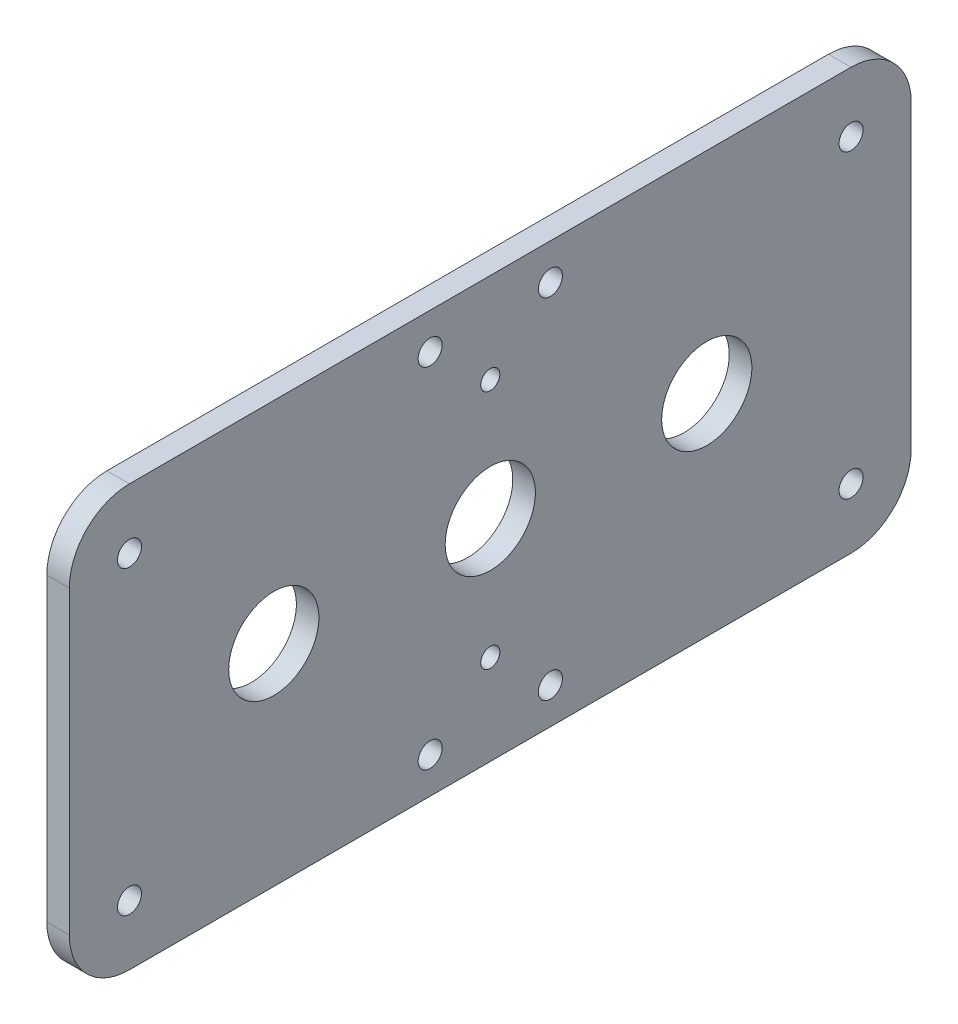
ISO-10303-21;
HEADER;
FILE_DESCRIPTION(('STEP AP214'),'2;1');
FILE_NAME('part.step','',(''),(''),'','','');
FILE_SCHEMA(('AUTOMOTIVE_DESIGN { 1 0 10303 214 1 1 1 1 }'));
ENDSEC;
DATA;
#1=APPLICATION_CONTEXT('core data for automotive mechanical design processes');
#2=APPLICATION_PROTOCOL_DEFINITION('international standard','automotive_design',2000,#1);
#3=PRODUCT_CONTEXT('',#1,'mechanical');
#4=PRODUCT('Part','Part','',(#3));
#5=PRODUCT_RELATED_PRODUCT_CATEGORY('part','',(#4));
#6=PRODUCT_DEFINITION_FORMATION('','',#4);
#7=PRODUCT_DEFINITION_CONTEXT('part definition',#1,'design');
#8=PRODUCT_DEFINITION('design','',#6,#7);
#9=PRODUCT_DEFINITION_SHAPE('','',#8);
#10=(LENGTH_UNIT() NAMED_UNIT(*) SI_UNIT(.MILLI.,.METRE.));
#11=(NAMED_UNIT(*) PLANE_ANGLE_UNIT() SI_UNIT($,.RADIAN.));
#12=(NAMED_UNIT(*) SI_UNIT($,.STERADIAN.) SOLID_ANGLE_UNIT());
#13=UNCERTAINTY_MEASURE_WITH_UNIT(LENGTH_MEASURE(1.E-05),#10,'distance_accuracy_value','');
#14=(GEOMETRIC_REPRESENTATION_CONTEXT(3) GLOBAL_UNCERTAINTY_ASSIGNED_CONTEXT((#13)) GLOBAL_UNIT_ASSIGNED_CONTEXT((#10,
#11,#12)) REPRESENTATION_CONTEXT('',''));
#15=CARTESIAN_POINT('',(0.,0.,0.));
#16=DIRECTION('',(0.,0.,1.));
#17=DIRECTION('',(1.,0.,0.));
#18=AXIS2_PLACEMENT_3D('',#15,#16,#17);
#19=CARTESIAN_POINT('',(4.7625,43.2742885665238,239.434866781271));
#20=DIRECTION('',(1.,0.,0.));
#21=DIRECTION('',(0.,0.,1.));
#22=AXIS2_PLACEMENT_3D('',#19,#20,#21);
#23=CYLINDRICAL_SURFACE('',#22,12.7);
#24=DIRECTION('',(1.,0.,0.));
#25=VECTOR('',#24,1.);
#26=CARTESIAN_POINT('',(4.7625,43.2742885665239,226.734866781271));
#27=LINE('',#26,#25);
#28=CARTESIAN_POINT('',(0.,43.2742885665239,226.734866781271));
#29=VERTEX_POINT('',#28);
#30=CARTESIAN_POINT('',(4.7625,43.2742885665239,226.734866781271));
#31=VERTEX_POINT('',#30);
#32=EDGE_CURVE('E11',#29,#31,#27,.T.);
#33=ORIENTED_EDGE('',*,*,#32,.T.);
#34=CARTESIAN_POINT('',(4.7625,43.2742885665238,239.434866781271));
#35=DIRECTION('',(-1.,0.,0.));
#36=DIRECTION('',(0.,0.,1.));
#37=AXIS2_PLACEMENT_3D('',#34,#35,#36);
#38=CIRCLE('',#37,12.7);
#39=CARTESIAN_POINT('',(4.7625,30.5742885665238,239.434866781271));
#40=VERTEX_POINT('',#39);
#41=EDGE_CURVE('E198',#31,#40,#38,.T.);
#42=ORIENTED_EDGE('',*,*,#41,.T.);
#43=DIRECTION('',(1.,0.,0.));
#44=VECTOR('',#43,1.);
#45=CARTESIAN_POINT('',(4.7625,30.5742885665238,239.434866781271));
#46=LINE('',#45,#44);
#47=CARTESIAN_POINT('',(0.,30.5742885665238,239.434866781271));
#48=VERTEX_POINT('',#47);
#49=EDGE_CURVE('E47',#48,#40,#46,.T.);
#50=ORIENTED_EDGE('',*,*,#49,.F.);
#51=CARTESIAN_POINT('',(0.,43.2742885665238,239.434866781271));
#52=DIRECTION('',(-1.,0.,0.));
#53=DIRECTION('',(0.,0.,1.));
#54=AXIS2_PLACEMENT_3D('',#51,#52,#53);
#55=CIRCLE('',#54,12.7);
#56=EDGE_CURVE('E93',#29,#48,#55,.T.);
#57=ORIENTED_EDGE('',*,*,#56,.F.);
#58=EDGE_LOOP('',(#33,#42,#50,#57));
#59=FACE_BOUND('',#58,.T.);
#60=ADVANCED_FACE('F37',(#59),#23,.T.);
#61=CARTESIAN_POINT('',(4.7625,30.5742885665238,391.834866781271));
#62=DIRECTION('',(0.,-1.,0.));
#63=DIRECTION('',(0.,0.,1.));
#64=AXIS2_PLACEMENT_3D('',#61,#62,#63);
#65=PLANE('',#64);
#66=ORIENTED_EDGE('',*,*,#49,.T.);
#67=DIRECTION('',(0.,0.,1.));
#68=VECTOR('',#67,1.);
#69=CARTESIAN_POINT('',(4.7625,30.5742885665238,391.834866781271));
#70=LINE('',#69,#68);
#71=CARTESIAN_POINT('',(4.7625,30.5742885665238,391.834866781271));
#72=VERTEX_POINT('',#71);
#73=EDGE_CURVE('E193',#40,#72,#70,.T.);
#74=ORIENTED_EDGE('',*,*,#73,.T.);
#75=DIRECTION('',(1.,0.,0.));
#76=VECTOR('',#75,1.);
#77=CARTESIAN_POINT('',(4.7625,30.5742885665238,391.834866781271));
#78=LINE('',#77,#76);
#79=CARTESIAN_POINT('',(0.,30.5742885665238,391.834866781271));
#80=VERTEX_POINT('',#79);
#81=EDGE_CURVE('E180',#80,#72,#78,.T.);
#82=ORIENTED_EDGE('',*,*,#81,.F.);
#83=DIRECTION('',(0.,0.,1.));
#84=VECTOR('',#83,1.);
#85=CARTESIAN_POINT('',(0.,30.5742885665238,239.434866781271));
#86=LINE('',#85,#84);
#87=EDGE_CURVE('E147',#48,#80,#86,.T.);
#88=ORIENTED_EDGE('',*,*,#87,.F.);
#89=EDGE_LOOP('',(#66,#74,#82,#88));
#90=FACE_BOUND('',#89,.T.);
#91=ADVANCED_FACE('F189',(#90),#65,.T.);
#92=CARTESIAN_POINT('',(4.7625,43.2742885665238,391.834866781271));
#93=DIRECTION('',(1.,0.,0.));
#94=DIRECTION('',(0.,0.,1.));
#95=AXIS2_PLACEMENT_3D('',#92,#93,#94);
#96=CYLINDRICAL_SURFACE('',#95,12.7);
#97=ORIENTED_EDGE('',*,*,#81,.T.);
#98=CARTESIAN_POINT('',(4.7625,43.2742885665238,391.834866781271));
#99=DIRECTION('',(-1.,0.,0.));
#100=DIRECTION('',(0.,0.,1.));
#101=AXIS2_PLACEMENT_3D('',#98,#99,#100);
#102=CIRCLE('',#101,12.7);
#103=CARTESIAN_POINT('',(4.7625,43.2742885665239,404.534866781271));
#104=VERTEX_POINT('',#103);
#105=EDGE_CURVE('E201',#72,#104,#102,.T.);
#106=ORIENTED_EDGE('',*,*,#105,.T.);
#107=DIRECTION('',(1.,0.,0.));
#108=VECTOR('',#107,1.);
#109=CARTESIAN_POINT('',(4.7625,43.2742885665239,404.534866781271));
#110=LINE('',#109,#108);
#111=CARTESIAN_POINT('',(0.,43.2742885665239,404.534866781271));
#112=VERTEX_POINT('',#111);
#113=EDGE_CURVE('E177',#112,#104,#110,.T.);
#114=ORIENTED_EDGE('',*,*,#113,.F.);
#115=CARTESIAN_POINT('',(0.,43.2742885665238,391.834866781271));
#116=DIRECTION('',(-1.,0.,0.));
#117=DIRECTION('',(0.,0.,1.));
#118=AXIS2_PLACEMENT_3D('',#115,#116,#117);
#119=CIRCLE('',#118,12.7);
#120=EDGE_CURVE('E144',#80,#112,#119,.T.);
#121=ORIENTED_EDGE('',*,*,#120,.F.);
#122=EDGE_LOOP('',(#97,#106,#114,#121));
#123=FACE_BOUND('',#122,.T.);
#124=ADVANCED_FACE('F264',(#123),#96,.T.);
#125=CARTESIAN_POINT('',(4.7625,43.2742885665239,404.534866781271));
#126=DIRECTION('',(0.,0.,1.));
#127=DIRECTION('',(0.,1.,0.));
#128=AXIS2_PLACEMENT_3D('',#125,#126,#127);
#129=PLANE('',#128);
#130=ORIENTED_EDGE('',*,*,#113,.T.);
#131=DIRECTION('',(0.,1.,0.));
#132=VECTOR('',#131,1.);
#133=CARTESIAN_POINT('',(4.7625,43.2742885665239,404.534866781271));
#134=LINE('',#133,#132);
#135=CARTESIAN_POINT('',(4.7625,106.774288566524,404.534866781271));
#136=VERTEX_POINT('',#135);
#137=EDGE_CURVE('E208',#104,#136,#134,.T.);
#138=ORIENTED_EDGE('',*,*,#137,.T.);
#139=DIRECTION('',(1.,0.,0.));
#140=VECTOR('',#139,1.);
#141=CARTESIAN_POINT('',(4.7625,106.774288566524,404.534866781271));
#142=LINE('',#141,#140);
#143=CARTESIAN_POINT('',(0.,106.774288566524,404.534866781271));
#144=VERTEX_POINT('',#143);
#145=EDGE_CURVE('E174',#144,#136,#142,.T.);
#146=ORIENTED_EDGE('',*,*,#145,.F.);
#147=DIRECTION('',(0.,1.,0.));
#148=VECTOR('',#147,1.);
#149=CARTESIAN_POINT('',(0.,106.774288566524,404.534866781271));
#150=LINE('',#149,#148);
#151=EDGE_CURVE('E141',#112,#144,#150,.T.);
#152=ORIENTED_EDGE('',*,*,#151,.F.);
#153=EDGE_LOOP('',(#130,#138,#146,#152));
#154=FACE_BOUND('',#153,.T.);
#155=ADVANCED_FACE('F375',(#154),#129,.T.);
#156=CARTESIAN_POINT('',(4.7625,106.774288566524,391.834866781271));
#157=DIRECTION('',(1.,0.,0.));
#158=DIRECTION('',(0.,0.,1.));
#159=AXIS2_PLACEMENT_3D('',#156,#157,#158);
#160=CYLINDRICAL_SURFACE('',#159,12.7);
#161=ORIENTED_EDGE('',*,*,#145,.T.);
#162=CARTESIAN_POINT('',(4.7625,106.774288566524,391.834866781271));
#163=DIRECTION('',(-1.,0.,0.));
#164=DIRECTION('',(0.,0.,1.));
#165=AXIS2_PLACEMENT_3D('',#162,#163,#164);
#166=CIRCLE('',#165,12.7);
#167=CARTESIAN_POINT('',(4.7625,119.474288566524,391.834866781271));
#168=VERTEX_POINT('',#167);
#169=EDGE_CURVE('E211',#136,#168,#166,.T.);
#170=ORIENTED_EDGE('',*,*,#169,.T.);
#171=DIRECTION('',(1.,0.,0.));
#172=VECTOR('',#171,1.);
#173=CARTESIAN_POINT('',(4.7625,119.474288566524,391.834866781271));
#174=LINE('',#173,#172);
#175=CARTESIAN_POINT('',(0.,119.474288566524,391.834866781271));
#176=VERTEX_POINT('',#175);
#177=EDGE_CURVE('E108',#176,#168,#174,.T.);
#178=ORIENTED_EDGE('',*,*,#177,.F.);
#179=CARTESIAN_POINT('',(0.,106.774288566524,391.834866781271));
#180=DIRECTION('',(-1.,0.,0.));
#181=DIRECTION('',(0.,0.,1.));
#182=AXIS2_PLACEMENT_3D('',#179,#180,#181);
#183=CIRCLE('',#182,12.7);
#184=EDGE_CURVE('E139',#144,#176,#183,.T.);
#185=ORIENTED_EDGE('',*,*,#184,.F.);
#186=EDGE_LOOP('',(#161,#170,#178,#185));
#187=FACE_BOUND('',#186,.T.);
#188=ADVANCED_FACE('F387',(#187),#160,.T.);
#189=CARTESIAN_POINT('',(4.7625,119.474288566524,391.834866781271));
#190=DIRECTION('',(0.,1.,0.));
#191=DIRECTION('',(0.,0.,-1.));
#192=AXIS2_PLACEMENT_3D('',#189,#190,#191);
#193=PLANE('',#192);
#194=ORIENTED_EDGE('',*,*,#177,.T.);
#195=DIRECTION('',(0.,0.,-1.));
#196=VECTOR('',#195,1.);
#197=CARTESIAN_POINT('',(4.7625,119.474288566524,391.834866781271));
#198=LINE('',#197,#196);
#199=CARTESIAN_POINT('',(4.7625,119.474288566524,239.434866781271));
#200=VERTEX_POINT('',#199);
#201=EDGE_CURVE('E214',#168,#200,#198,.T.);
#202=ORIENTED_EDGE('',*,*,#201,.T.);
#203=DIRECTION('',(1.,0.,0.));
#204=VECTOR('',#203,1.);
#205=CARTESIAN_POINT('',(4.7625,119.474288566524,239.434866781271));
#206=LINE('',#205,#204);
#207=CARTESIAN_POINT('',(0.,119.474288566524,239.434866781271));
#208=VERTEX_POINT('',#207);
#209=EDGE_CURVE('E106',#208,#200,#206,.T.);
#210=ORIENTED_EDGE('',*,*,#209,.F.);
#211=DIRECTION('',(0.,0.,1.));
#212=VECTOR('',#211,1.);
#213=CARTESIAN_POINT('',(0.,119.474288566524,239.434866781271));
#214=LINE('',#213,#212);
#215=EDGE_CURVE('E100',#176,#208,#214,.F.);
#216=ORIENTED_EDGE('',*,*,#215,.F.);
#217=EDGE_LOOP('',(#194,#202,#210,#216));
#218=FACE_BOUND('',#217,.T.);
#219=ADVANCED_FACE('F400',(#218),#193,.T.);
#220=CARTESIAN_POINT('',(4.7625,106.774288566524,239.434866781271));
#221=DIRECTION('',(1.,0.,0.));
#222=DIRECTION('',(0.,0.,1.));
#223=AXIS2_PLACEMENT_3D('',#220,#221,#222);
#224=CYLINDRICAL_SURFACE('',#223,12.7);
#225=ORIENTED_EDGE('',*,*,#209,.T.);
#226=CARTESIAN_POINT('',(4.7625,106.774288566524,239.434866781271));
#227=DIRECTION('',(-1.,0.,0.));
#228=DIRECTION('',(0.,0.,1.));
#229=AXIS2_PLACEMENT_3D('',#226,#227,#228);
#230=CIRCLE('',#229,12.7);
#231=CARTESIAN_POINT('',(4.7625,106.774288566524,226.734866781271));
#232=VERTEX_POINT('',#231);
#233=EDGE_CURVE('E55',#200,#232,#230,.T.);
#234=ORIENTED_EDGE('',*,*,#233,.T.);
#235=DIRECTION('',(1.,0.,0.));
#236=VECTOR('',#235,1.);
#237=CARTESIAN_POINT('',(4.7625,106.774288566524,226.734866781271));
#238=LINE('',#237,#236);
#239=CARTESIAN_POINT('',(0.,106.774288566524,226.734866781271));
#240=VERTEX_POINT('',#239);
#241=EDGE_CURVE('E41',#240,#232,#238,.T.);
#242=ORIENTED_EDGE('',*,*,#241,.F.);
#243=CARTESIAN_POINT('',(0.,106.774288566524,239.434866781271));
#244=DIRECTION('',(-1.,0.,0.));
#245=DIRECTION('',(0.,0.,1.));
#246=AXIS2_PLACEMENT_3D('',#243,#244,#245);
#247=CIRCLE('',#246,12.7);
#248=EDGE_CURVE('E94',#208,#240,#247,.T.);
#249=ORIENTED_EDGE('',*,*,#248,.F.);
#250=EDGE_LOOP('',(#225,#234,#242,#249));
#251=FACE_BOUND('',#250,.T.);
#252=ADVANCED_FACE('F105',(#251),#224,.T.);
#253=CARTESIAN_POINT('',(4.7625,75.0242885665238,269.914866781271));
#254=DIRECTION('',(1.,0.,0.));
#255=DIRECTION('',(0.,0.,1.));
#256=AXIS2_PLACEMENT_3D('',#253,#254,#255);
#257=CYLINDRICAL_SURFACE('',#256,9.52500000000002);
#258=CARTESIAN_POINT('',(4.7625,75.0242885665238,269.914866781271));
#259=DIRECTION('',(-1.,0.,0.));
#260=DIRECTION('',(0.,0.,1.));
#261=AXIS2_PLACEMENT_3D('',#258,#259,#260);
#262=CIRCLE('',#261,9.52500000000002);
#263=CARTESIAN_POINT('',(4.7625,75.0242885665238,279.439866781271));
#264=VERTEX_POINT('',#263);
#265=EDGE_CURVE('E170',#264,#264,#262,.T.);
#266=ORIENTED_EDGE('',*,*,#265,.F.);
#267=EDGE_LOOP('',(#266));
#268=FACE_BOUND('',#267,.T.);
#269=CARTESIAN_POINT('',(0.,75.0242885665238,269.914866781271));
#270=DIRECTION('',(-1.,0.,0.));
#271=DIRECTION('',(0.,0.,1.));
#272=AXIS2_PLACEMENT_3D('',#269,#270,#271);
#273=CIRCLE('',#272,9.52500000000002);
#274=CARTESIAN_POINT('',(0.,75.0242885665238,279.439866781271));
#275=VERTEX_POINT('',#274);
#276=EDGE_CURVE('E120',#275,#275,#273,.T.);
#277=ORIENTED_EDGE('',*,*,#276,.T.);
#278=EDGE_LOOP('',(#277));
#279=FACE_BOUND('',#278,.T.);
#280=ADVANCED_FACE('F331',(#268,#279),#257,.F.);
#281=CARTESIAN_POINT('',(4.7625,106.774288566524,239.434866781271));
#282=DIRECTION('',(1.,0.,0.));
#283=DIRECTION('',(0.,0.,1.));
#284=AXIS2_PLACEMENT_3D('',#281,#282,#283);
#285=CYLINDRICAL_SURFACE('',#284,2.53999999999998);
#286=CARTESIAN_POINT('',(4.7625,106.774288566524,239.434866781271));
#287=DIRECTION('',(-1.,0.,0.));
#288=DIRECTION('',(0.,0.,1.));
#289=AXIS2_PLACEMENT_3D('',#286,#287,#288);
#290=CIRCLE('',#289,2.53999999999998);
#291=CARTESIAN_POINT('',(4.7625,106.774288566524,241.974866781271));
#292=VERTEX_POINT('',#291);
#293=EDGE_CURVE('E590',#292,#292,#290,.T.);
#294=ORIENTED_EDGE('',*,*,#293,.F.);
#295=EDGE_LOOP('',(#294));
#296=FACE_BOUND('',#295,.T.);
#297=CARTESIAN_POINT('',(0.,106.774288566524,239.434866781271));
#298=DIRECTION('',(-1.,0.,0.));
#299=DIRECTION('',(0.,0.,1.));
#300=AXIS2_PLACEMENT_3D('',#297,#298,#299);
#301=CIRCLE('',#300,2.53999999999998);
#302=CARTESIAN_POINT('',(0.,106.774288566524,241.974866781271));
#303=VERTEX_POINT('',#302);
#304=EDGE_CURVE('E123',#303,#303,#301,.T.);
#305=ORIENTED_EDGE('',*,*,#304,.T.);
#306=EDGE_LOOP('',(#305));
#307=FACE_BOUND('',#306,.T.);
#308=ADVANCED_FACE('F336',(#296,#307),#285,.F.);
#309=CARTESIAN_POINT('',(4.7625,75.0242885665238,315.634866781271));
#310=DIRECTION('',(1.,0.,0.));
#311=DIRECTION('',(0.,0.,1.));
#312=AXIS2_PLACEMENT_3D('',#309,#310,#311);
#313=CYLINDRICAL_SURFACE('',#312,9.52500000000002);
#314=CARTESIAN_POINT('',(4.7625,75.0242885665238,315.634866781271));
#315=DIRECTION('',(-1.,0.,0.));
#316=DIRECTION('',(0.,0.,1.));
#317=AXIS2_PLACEMENT_3D('',#314,#315,#316);
#318=CIRCLE('',#317,9.52500000000002);
#319=CARTESIAN_POINT('',(4.7625,75.0242885665238,325.159866781271));
#320=VERTEX_POINT('',#319);
#321=EDGE_CURVE('E587',#320,#320,#318,.T.);
#322=ORIENTED_EDGE('',*,*,#321,.F.);
#323=EDGE_LOOP('',(#322));
#324=FACE_BOUND('',#323,.T.);
#325=CARTESIAN_POINT('',(0.,75.0242885665238,315.634866781271));
#326=DIRECTION('',(-1.,0.,0.));
#327=DIRECTION('',(0.,0.,1.));
#328=AXIS2_PLACEMENT_3D('',#325,#326,#327);
#329=CIRCLE('',#328,9.52500000000002);
#330=CARTESIAN_POINT('',(0.,75.0242885665238,325.159866781271));
#331=VERTEX_POINT('',#330);
#332=EDGE_CURVE('E126',#331,#331,#329,.T.);
#333=ORIENTED_EDGE('',*,*,#332,.T.);
#334=EDGE_LOOP('',(#333));
#335=FACE_BOUND('',#334,.T.);
#336=ADVANCED_FACE('F349',(#324,#335),#313,.F.);
#337=CARTESIAN_POINT('',(4.7625,43.2742885665238,239.434866781271));
#338=DIRECTION('',(1.,0.,0.));
#339=DIRECTION('',(0.,0.,1.));
#340=AXIS2_PLACEMENT_3D('',#337,#338,#339);
#341=CYLINDRICAL_SURFACE('',#340,2.53999999999998);
#342=CARTESIAN_POINT('',(4.7625,43.2742885665238,239.434866781271));
#343=DIRECTION('',(-1.,0.,0.));
#344=DIRECTION('',(0.,0.,1.));
#345=AXIS2_PLACEMENT_3D('',#342,#343,#344);
#346=CIRCLE('',#345,2.53999999999998);
#347=CARTESIAN_POINT('',(4.7625,43.2742885665238,241.974866781271));
#348=VERTEX_POINT('',#347);
#349=EDGE_CURVE('E582',#348,#348,#346,.T.);
#350=ORIENTED_EDGE('',*,*,#349,.F.);
#351=EDGE_LOOP('',(#350));
#352=FACE_BOUND('',#351,.T.);
#353=CARTESIAN_POINT('',(0.,43.2742885665238,239.434866781271));
#354=DIRECTION('',(-1.,0.,0.));
#355=DIRECTION('',(0.,0.,1.));
#356=AXIS2_PLACEMENT_3D('',#353,#354,#355);
#357=CIRCLE('',#356,2.53999999999998);
#358=CARTESIAN_POINT('',(0.,43.2742885665238,241.974866781271));
#359=VERTEX_POINT('',#358);
#360=EDGE_CURVE('E129',#359,#359,#357,.T.);
#361=ORIENTED_EDGE('',*,*,#360,.T.);
#362=EDGE_LOOP('',(#361));
#363=FACE_BOUND('',#362,.T.);
#364=ADVANCED_FACE('F362',(#352,#363),#341,.F.);
#365=CARTESIAN_POINT('',(4.7625,38.1942885665238,302.934866781271));
#366=DIRECTION('',(1.,0.,0.));
#367=DIRECTION('',(0.,0.,1.));
#368=AXIS2_PLACEMENT_3D('',#365,#366,#367);
#369=CYLINDRICAL_SURFACE('',#368,2.54000000000001);
#370=CARTESIAN_POINT('',(4.7625,38.1942885665238,302.934866781271));
#371=DIRECTION('',(-1.,0.,0.));
#372=DIRECTION('',(0.,0.,1.));
#373=AXIS2_PLACEMENT_3D('',#370,#371,#372);
#374=CIRCLE('',#373,2.54000000000001);
#375=CARTESIAN_POINT('',(4.7625,38.1942885665238,305.474866781271));
#376=VERTEX_POINT('',#375);
#377=EDGE_CURVE('E579',#376,#376,#374,.T.);
#378=ORIENTED_EDGE('',*,*,#377,.F.);
#379=EDGE_LOOP('',(#378));
#380=FACE_BOUND('',#379,.T.);
#381=CARTESIAN_POINT('',(0.,38.1942885665238,302.934866781271));
#382=DIRECTION('',(-1.,0.,0.));
#383=DIRECTION('',(0.,0.,1.));
#384=AXIS2_PLACEMENT_3D('',#381,#382,#383);
#385=CIRCLE('',#384,2.54000000000001);
#386=CARTESIAN_POINT('',(0.,38.1942885665238,305.474866781271));
#387=VERTEX_POINT('',#386);
#388=EDGE_CURVE('E132',#387,#387,#385,.T.);
#389=ORIENTED_EDGE('',*,*,#388,.T.);
#390=EDGE_LOOP('',(#389));
#391=FACE_BOUND('',#390,.T.);
#392=ADVANCED_FACE('F444',(#380,#391),#369,.F.);
#393=CARTESIAN_POINT('',(4.7625,111.854288566524,328.334866781271));
#394=DIRECTION('',(1.,0.,0.));
#395=DIRECTION('',(0.,0.,1.));
#396=AXIS2_PLACEMENT_3D('',#393,#394,#395);
#397=CYLINDRICAL_SURFACE('',#396,2.54000000000001);
#398=CARTESIAN_POINT('',(4.7625,111.854288566524,328.334866781271));
#399=DIRECTION('',(-1.,0.,0.));
#400=DIRECTION('',(0.,0.,1.));
#401=AXIS2_PLACEMENT_3D('',#398,#399,#400);
#402=CIRCLE('',#401,2.54000000000001);
#403=CARTESIAN_POINT('',(4.7625,111.854288566524,330.874866781271));
#404=VERTEX_POINT('',#403);
#405=EDGE_CURVE('E575',#404,#404,#402,.T.);
#406=ORIENTED_EDGE('',*,*,#405,.F.);
#407=EDGE_LOOP('',(#406));
#408=FACE_BOUND('',#407,.T.);
#409=CARTESIAN_POINT('',(0.,111.854288566524,328.334866781271));
#410=DIRECTION('',(-1.,0.,0.));
#411=DIRECTION('',(0.,0.,1.));
#412=AXIS2_PLACEMENT_3D('',#409,#410,#411);
#413=CIRCLE('',#412,2.54000000000001);
#414=CARTESIAN_POINT('',(0.,111.854288566524,330.874866781271));
#415=VERTEX_POINT('',#414);
#416=EDGE_CURVE('E103',#415,#415,#413,.T.);
#417=ORIENTED_EDGE('',*,*,#416,.T.);
#418=EDGE_LOOP('',(#417));
#419=FACE_BOUND('',#418,.T.);
#420=ADVANCED_FACE('F271',(#408,#419),#397,.F.);
#421=CARTESIAN_POINT('',(4.7625,43.2742885665239,226.734866781271));
#422=DIRECTION('',(0.,0.,-1.));
#423=DIRECTION('',(0.,-1.,0.));
#424=AXIS2_PLACEMENT_3D('',#421,#422,#423);
#425=PLANE('',#424);
#426=DIRECTION('',(0.,1.,0.));
#427=VECTOR('',#426,1.);
#428=CARTESIAN_POINT('',(0.,106.774288566524,226.734866781271));
#429=LINE('',#428,#427);
#430=EDGE_CURVE('E85',#240,#29,#429,.F.);
#431=ORIENTED_EDGE('',*,*,#430,.F.);
#432=ORIENTED_EDGE('',*,*,#241,.T.);
#433=DIRECTION('',(0.,-1.,0.));
#434=VECTOR('',#433,1.);
#435=CARTESIAN_POINT('',(4.7625,43.2742885665239,226.734866781271));
#436=LINE('',#435,#434);
#437=EDGE_CURVE('E199',#232,#31,#436,.T.);
#438=ORIENTED_EDGE('',*,*,#437,.T.);
#439=ORIENTED_EDGE('',*,*,#32,.F.);
#440=EDGE_LOOP('',(#431,#432,#438,#439));
#441=FACE_BOUND('',#440,.T.);
#442=ADVANCED_FACE('F90',(#441),#425,.T.);
#443=CARTESIAN_POINT('',(4.7625,111.854288566524,302.934866781271));
#444=DIRECTION('',(1.,0.,0.));
#445=DIRECTION('',(0.,0.,1.));
#446=AXIS2_PLACEMENT_3D('',#443,#444,#445);
#447=CYLINDRICAL_SURFACE('',#446,2.54000000000001);
#448=CARTESIAN_POINT('',(4.7625,111.854288566524,302.934866781271));
#449=DIRECTION('',(-1.,0.,0.));
#450=DIRECTION('',(0.,0.,1.));
#451=AXIS2_PLACEMENT_3D('',#448,#449,#450);
#452=CIRCLE('',#451,2.54000000000001);
#453=CARTESIAN_POINT('',(4.7625,111.854288566524,305.474866781271));
#454=VERTEX_POINT('',#453);
#455=EDGE_CURVE('E217',#454,#454,#452,.T.);
#456=ORIENTED_EDGE('',*,*,#455,.F.);
#457=EDGE_LOOP('',(#456));
#458=FACE_BOUND('',#457,.T.);
#459=CARTESIAN_POINT('',(0.,111.854288566524,302.934866781271));
#460=DIRECTION('',(-1.,0.,0.));
#461=DIRECTION('',(0.,0.,1.));
#462=AXIS2_PLACEMENT_3D('',#459,#460,#461);
#463=CIRCLE('',#462,2.54000000000001);
#464=CARTESIAN_POINT('',(0.,111.854288566524,305.474866781271));
#465=VERTEX_POINT('',#464);
#466=EDGE_CURVE('E138',#465,#465,#463,.T.);
#467=ORIENTED_EDGE('',*,*,#466,.T.);
#468=EDGE_LOOP('',(#467));
#469=FACE_BOUND('',#468,.T.);
#470=ADVANCED_FACE('F270',(#458,#469),#447,.F.);
#471=CARTESIAN_POINT('',(4.7625,100.424288566524,315.634866781271));
#472=DIRECTION('',(1.,0.,0.));
#473=DIRECTION('',(0.,0.,1.));
#474=AXIS2_PLACEMENT_3D('',#471,#472,#473);
#475=CYLINDRICAL_SURFACE('',#474,2.01929999999998);
#476=CARTESIAN_POINT('',(4.7625,100.424288566524,315.634866781271));
#477=DIRECTION('',(-1.,0.,0.));
#478=DIRECTION('',(0.,0.,1.));
#479=AXIS2_PLACEMENT_3D('',#476,#477,#478);
#480=CIRCLE('',#479,2.01929999999998);
#481=CARTESIAN_POINT('',(4.7625,100.424288566524,317.654166781271));
#482=VERTEX_POINT('',#481);
#483=EDGE_CURVE('E220',#482,#482,#480,.T.);
#484=ORIENTED_EDGE('',*,*,#483,.F.);
#485=EDGE_LOOP('',(#484));
#486=FACE_BOUND('',#485,.T.);
#487=CARTESIAN_POINT('',(0.,100.424288566524,315.634866781271));
#488=DIRECTION('',(-1.,0.,0.));
#489=DIRECTION('',(0.,0.,1.));
#490=AXIS2_PLACEMENT_3D('',#487,#488,#489);
#491=CIRCLE('',#490,2.01929999999998);
#492=CARTESIAN_POINT('',(0.,100.424288566524,317.654166781271));
#493=VERTEX_POINT('',#492);
#494=EDGE_CURVE('E153',#493,#493,#491,.T.);
#495=ORIENTED_EDGE('',*,*,#494,.T.);
#496=EDGE_LOOP('',(#495));
#497=FACE_BOUND('',#496,.T.);
#498=ADVANCED_FACE('F274',(#486,#497),#475,.F.);
#499=CARTESIAN_POINT('',(4.7625,38.1942885665238,328.334866781271));
#500=DIRECTION('',(1.,0.,0.));
#501=DIRECTION('',(0.,0.,1.));
#502=AXIS2_PLACEMENT_3D('',#499,#500,#501);
#503=CYLINDRICAL_SURFACE('',#502,2.54000000000001);
#504=CARTESIAN_POINT('',(4.7625,38.1942885665238,328.334866781271));
#505=DIRECTION('',(-1.,0.,0.));
#506=DIRECTION('',(0.,0.,1.));
#507=AXIS2_PLACEMENT_3D('',#504,#505,#506);
#508=CIRCLE('',#507,2.54000000000001);
#509=CARTESIAN_POINT('',(4.7625,38.1942885665238,330.874866781271));
#510=VERTEX_POINT('',#509);
#511=EDGE_CURVE('E223',#510,#510,#508,.T.);
#512=ORIENTED_EDGE('',*,*,#511,.F.);
#513=EDGE_LOOP('',(#512));
#514=FACE_BOUND('',#513,.T.);
#515=CARTESIAN_POINT('',(0.,38.1942885665238,328.334866781271));
#516=DIRECTION('',(-1.,0.,0.));
#517=DIRECTION('',(0.,0.,1.));
#518=AXIS2_PLACEMENT_3D('',#515,#516,#517);
#519=CIRCLE('',#518,2.54000000000001);
#520=CARTESIAN_POINT('',(0.,38.1942885665238,330.874866781271));
#521=VERTEX_POINT('',#520);
#522=EDGE_CURVE('E156',#521,#521,#519,.T.);
#523=ORIENTED_EDGE('',*,*,#522,.T.);
#524=EDGE_LOOP('',(#523));
#525=FACE_BOUND('',#524,.T.);
#526=ADVANCED_FACE('F278',(#514,#525),#503,.F.);
#527=CARTESIAN_POINT('',(4.7625,43.2742885665238,391.834866781271));
#528=DIRECTION('',(1.,0.,0.));
#529=DIRECTION('',(0.,0.,1.));
#530=AXIS2_PLACEMENT_3D('',#527,#528,#529);
#531=CYLINDRICAL_SURFACE('',#530,2.53999999999995);
#532=CARTESIAN_POINT('',(4.7625,43.2742885665238,391.834866781271));
#533=DIRECTION('',(-1.,0.,0.));
#534=DIRECTION('',(0.,0.,1.));
#535=AXIS2_PLACEMENT_3D('',#532,#533,#534);
#536=CIRCLE('',#535,2.53999999999995);
#537=CARTESIAN_POINT('',(4.7625,43.2742885665238,394.374866781271));
#538=VERTEX_POINT('',#537);
#539=EDGE_CURVE('E226',#538,#538,#536,.T.);
#540=ORIENTED_EDGE('',*,*,#539,.F.);
#541=EDGE_LOOP('',(#540));
#542=FACE_BOUND('',#541,.T.);
#543=CARTESIAN_POINT('',(0.,43.2742885665238,391.834866781271));
#544=DIRECTION('',(-1.,0.,0.));
#545=DIRECTION('',(0.,0.,1.));
#546=AXIS2_PLACEMENT_3D('',#543,#544,#545);
#547=CIRCLE('',#546,2.53999999999995);
#548=CARTESIAN_POINT('',(0.,43.2742885665238,394.374866781271));
#549=VERTEX_POINT('',#548);
#550=EDGE_CURVE('E159',#549,#549,#547,.T.);
#551=ORIENTED_EDGE('',*,*,#550,.T.);
#552=EDGE_LOOP('',(#551));
#553=FACE_BOUND('',#552,.T.);
#554=ADVANCED_FACE('F238',(#542,#553),#531,.F.);
#555=CARTESIAN_POINT('',(4.7625,49.6242885665238,315.634866781271));
#556=DIRECTION('',(1.,0.,0.));
#557=DIRECTION('',(0.,0.,1.));
#558=AXIS2_PLACEMENT_3D('',#555,#556,#557);
#559=CYLINDRICAL_SURFACE('',#558,2.01929999999998);
#560=CARTESIAN_POINT('',(4.7625,49.6242885665238,315.634866781271));
#561=DIRECTION('',(-1.,0.,0.));
#562=DIRECTION('',(0.,0.,1.));
#563=AXIS2_PLACEMENT_3D('',#560,#561,#562);
#564=CIRCLE('',#563,2.01929999999998);
#565=CARTESIAN_POINT('',(4.7625,49.6242885665238,317.654166781271));
#566=VERTEX_POINT('',#565);
#567=EDGE_CURVE('E116',#566,#566,#564,.T.);
#568=ORIENTED_EDGE('',*,*,#567,.F.);
#569=EDGE_LOOP('',(#568));
#570=FACE_BOUND('',#569,.T.);
#571=CARTESIAN_POINT('',(0.,49.6242885665238,315.634866781271));
#572=DIRECTION('',(-1.,0.,0.));
#573=DIRECTION('',(0.,0.,1.));
#574=AXIS2_PLACEMENT_3D('',#571,#572,#573);
#575=CIRCLE('',#574,2.01929999999998);
#576=CARTESIAN_POINT('',(0.,49.6242885665238,317.654166781271));
#577=VERTEX_POINT('',#576);
#578=EDGE_CURVE('E162',#577,#577,#575,.T.);
#579=ORIENTED_EDGE('',*,*,#578,.T.);
#580=EDGE_LOOP('',(#579));
#581=FACE_BOUND('',#580,.T.);
#582=ADVANCED_FACE('F234',(#570,#581),#559,.F.);
#583=CARTESIAN_POINT('',(4.7625,106.774288566524,391.834866781271));
#584=DIRECTION('',(1.,0.,0.));
#585=DIRECTION('',(0.,0.,1.));
#586=AXIS2_PLACEMENT_3D('',#583,#584,#585);
#587=CYLINDRICAL_SURFACE('',#586,2.53999999999995);
#588=CARTESIAN_POINT('',(4.7625,106.774288566524,391.834866781271));
#589=DIRECTION('',(-1.,0.,0.));
#590=DIRECTION('',(0.,0.,1.));
#591=AXIS2_PLACEMENT_3D('',#588,#589,#590);
#592=CIRCLE('',#591,2.53999999999995);
#593=CARTESIAN_POINT('',(4.7625,106.774288566524,394.374866781271));
#594=VERTEX_POINT('',#593);
#595=EDGE_CURVE('E111',#594,#594,#592,.T.);
#596=ORIENTED_EDGE('',*,*,#595,.F.);
#597=EDGE_LOOP('',(#596));
#598=FACE_BOUND('',#597,.T.);
#599=CARTESIAN_POINT('',(0.,106.774288566524,391.834866781271));
#600=DIRECTION('',(-1.,0.,0.));
#601=DIRECTION('',(0.,0.,1.));
#602=AXIS2_PLACEMENT_3D('',#599,#600,#601);
#603=CIRCLE('',#602,2.53999999999995);
#604=CARTESIAN_POINT('',(0.,106.774288566524,394.374866781271));
#605=VERTEX_POINT('',#604);
#606=EDGE_CURVE('E165',#605,#605,#603,.T.);
#607=ORIENTED_EDGE('',*,*,#606,.T.);
#608=EDGE_LOOP('',(#607));
#609=FACE_BOUND('',#608,.T.);
#610=ADVANCED_FACE('F237',(#598,#609),#587,.F.);
#611=CARTESIAN_POINT('',(4.7625,75.0242885665238,361.354866781271));
#612=DIRECTION('',(1.,0.,0.));
#613=DIRECTION('',(0.,0.,1.));
#614=AXIS2_PLACEMENT_3D('',#611,#612,#613);
#615=CYLINDRICAL_SURFACE('',#614,9.52500000000002);
#616=CARTESIAN_POINT('',(4.7625,75.0242885665238,361.354866781271));
#617=DIRECTION('',(-1.,0.,0.));
#618=DIRECTION('',(0.,0.,1.));
#619=AXIS2_PLACEMENT_3D('',#616,#617,#618);
#620=CIRCLE('',#619,9.52500000000002);
#621=CARTESIAN_POINT('',(4.7625,75.0242885665238,370.879866781271));
#622=VERTEX_POINT('',#621);
#623=EDGE_CURVE('E107',#622,#622,#620,.T.);
#624=ORIENTED_EDGE('',*,*,#623,.F.);
#625=EDGE_LOOP('',(#624));
#626=FACE_BOUND('',#625,.T.);
#627=CARTESIAN_POINT('',(0.,75.0242885665238,361.354866781271));
#628=DIRECTION('',(-1.,0.,0.));
#629=DIRECTION('',(0.,0.,1.));
#630=AXIS2_PLACEMENT_3D('',#627,#628,#629);
#631=CIRCLE('',#630,9.52500000000002);
#632=CARTESIAN_POINT('',(0.,75.0242885665238,370.879866781271));
#633=VERTEX_POINT('',#632);
#634=EDGE_CURVE('E168',#633,#633,#631,.T.);
#635=ORIENTED_EDGE('',*,*,#634,.T.);
#636=EDGE_LOOP('',(#635));
#637=FACE_BOUND('',#636,.T.);
#638=ADVANCED_FACE('F39',(#626,#637),#615,.F.);
#639=CARTESIAN_POINT('',(4.7625,106.774288566524,239.434866781271));
#640=DIRECTION('',(1.,0.,0.));
#641=DIRECTION('',(0.,0.,1.));
#642=AXIS2_PLACEMENT_3D('',#639,#640,#641);
#643=PLANE('',#642);
#644=ORIENTED_EDGE('',*,*,#265,.T.);
#645=EDGE_LOOP('',(#644));
#646=FACE_BOUND('',#645,.T.);
#647=ORIENTED_EDGE('',*,*,#293,.T.);
#648=EDGE_LOOP('',(#647));
#649=FACE_BOUND('',#648,.T.);
#650=ORIENTED_EDGE('',*,*,#321,.T.);
#651=EDGE_LOOP('',(#650));
#652=FACE_BOUND('',#651,.T.);
#653=ORIENTED_EDGE('',*,*,#349,.T.);
#654=EDGE_LOOP('',(#653));
#655=FACE_BOUND('',#654,.T.);
#656=ORIENTED_EDGE('',*,*,#377,.T.);
#657=EDGE_LOOP('',(#656));
#658=FACE_BOUND('',#657,.T.);
#659=ORIENTED_EDGE('',*,*,#405,.T.);
#660=EDGE_LOOP('',(#659));
#661=FACE_BOUND('',#660,.T.);
#662=ORIENTED_EDGE('',*,*,#233,.F.);
#663=ORIENTED_EDGE('',*,*,#201,.F.);
#664=ORIENTED_EDGE('',*,*,#169,.F.);
#665=ORIENTED_EDGE('',*,*,#137,.F.);
#666=ORIENTED_EDGE('',*,*,#105,.F.);
#667=ORIENTED_EDGE('',*,*,#73,.F.);
#668=ORIENTED_EDGE('',*,*,#41,.F.);
#669=ORIENTED_EDGE('',*,*,#437,.F.);
#670=EDGE_LOOP('',(#662,#663,#664,#665,#666,#667,#668,#669));
#671=FACE_BOUND('',#670,.T.);
#672=ORIENTED_EDGE('',*,*,#455,.T.);
#673=EDGE_LOOP('',(#672));
#674=FACE_BOUND('',#673,.T.);
#675=ORIENTED_EDGE('',*,*,#483,.T.);
#676=EDGE_LOOP('',(#675));
#677=FACE_BOUND('',#676,.T.);
#678=ORIENTED_EDGE('',*,*,#511,.T.);
#679=EDGE_LOOP('',(#678));
#680=FACE_BOUND('',#679,.T.);
#681=ORIENTED_EDGE('',*,*,#539,.T.);
#682=EDGE_LOOP('',(#681));
#683=FACE_BOUND('',#682,.T.);
#684=ORIENTED_EDGE('',*,*,#567,.T.);
#685=EDGE_LOOP('',(#684));
#686=FACE_BOUND('',#685,.T.);
#687=ORIENTED_EDGE('',*,*,#595,.T.);
#688=EDGE_LOOP('',(#687));
#689=FACE_BOUND('',#688,.T.);
#690=ORIENTED_EDGE('',*,*,#623,.T.);
#691=EDGE_LOOP('',(#690));
#692=FACE_BOUND('',#691,.T.);
#693=ADVANCED_FACE('F231',(#646,#649,#652,#655,#658,#661,#671,#674,#677,#680,#683,#686,#689,
#692),#643,.T.);
#694=CARTESIAN_POINT('',(0.,106.774288566524,239.434866781271));
#695=DIRECTION('',(1.,0.,0.));
#696=DIRECTION('',(0.,0.,1.));
#697=AXIS2_PLACEMENT_3D('',#694,#695,#696);
#698=PLANE('',#697);
#699=ORIENTED_EDGE('',*,*,#276,.F.);
#700=EDGE_LOOP('',(#699));
#701=FACE_BOUND('',#700,.T.);
#702=ORIENTED_EDGE('',*,*,#304,.F.);
#703=EDGE_LOOP('',(#702));
#704=FACE_BOUND('',#703,.T.);
#705=ORIENTED_EDGE('',*,*,#332,.F.);
#706=EDGE_LOOP('',(#705));
#707=FACE_BOUND('',#706,.T.);
#708=ORIENTED_EDGE('',*,*,#360,.F.);
#709=EDGE_LOOP('',(#708));
#710=FACE_BOUND('',#709,.T.);
#711=ORIENTED_EDGE('',*,*,#388,.F.);
#712=EDGE_LOOP('',(#711));
#713=FACE_BOUND('',#712,.T.);
#714=ORIENTED_EDGE('',*,*,#416,.F.);
#715=EDGE_LOOP('',(#714));
#716=FACE_BOUND('',#715,.T.);
#717=ORIENTED_EDGE('',*,*,#248,.T.);
#718=ORIENTED_EDGE('',*,*,#430,.T.);
#719=ORIENTED_EDGE('',*,*,#56,.T.);
#720=ORIENTED_EDGE('',*,*,#87,.T.);
#721=ORIENTED_EDGE('',*,*,#120,.T.);
#722=ORIENTED_EDGE('',*,*,#151,.T.);
#723=ORIENTED_EDGE('',*,*,#184,.T.);
#724=ORIENTED_EDGE('',*,*,#215,.T.);
#725=EDGE_LOOP('',(#717,#718,#719,#720,#721,#722,#723,#724));
#726=FACE_BOUND('',#725,.T.);
#727=ORIENTED_EDGE('',*,*,#466,.F.);
#728=EDGE_LOOP('',(#727));
#729=FACE_BOUND('',#728,.T.);
#730=ORIENTED_EDGE('',*,*,#494,.F.);
#731=EDGE_LOOP('',(#730));
#732=FACE_BOUND('',#731,.T.);
#733=ORIENTED_EDGE('',*,*,#522,.F.);
#734=EDGE_LOOP('',(#733));
#735=FACE_BOUND('',#734,.T.);
#736=ORIENTED_EDGE('',*,*,#550,.F.);
#737=EDGE_LOOP('',(#736));
#738=FACE_BOUND('',#737,.T.);
#739=ORIENTED_EDGE('',*,*,#578,.F.);
#740=EDGE_LOOP('',(#739));
#741=FACE_BOUND('',#740,.T.);
#742=ORIENTED_EDGE('',*,*,#606,.F.);
#743=EDGE_LOOP('',(#742));
#744=FACE_BOUND('',#743,.T.);
#745=ORIENTED_EDGE('',*,*,#634,.F.);
#746=EDGE_LOOP('',(#745));
#747=FACE_BOUND('',#746,.T.);
#748=ADVANCED_FACE('F97',(#701,#704,#707,#710,#713,#716,#726,#729,#732,#735,#738,#741,#744,
#747),#698,.F.);
#749=CLOSED_SHELL('',(#60,#91,#124,#155,#188,#219,#252,#280,#308,#336,#364,#392,#420,#442,#470,
#498,#526,#554,#582,#610,#638,#693,#748));
#750=MANIFOLD_SOLID_BREP('B2',#749);
#751=ADVANCED_BREP_SHAPE_REPRESENTATION('',(#18,#750),#14);
#752=SHAPE_DEFINITION_REPRESENTATION(#9,#751);
ENDSEC;
END-ISO-10303-21;
